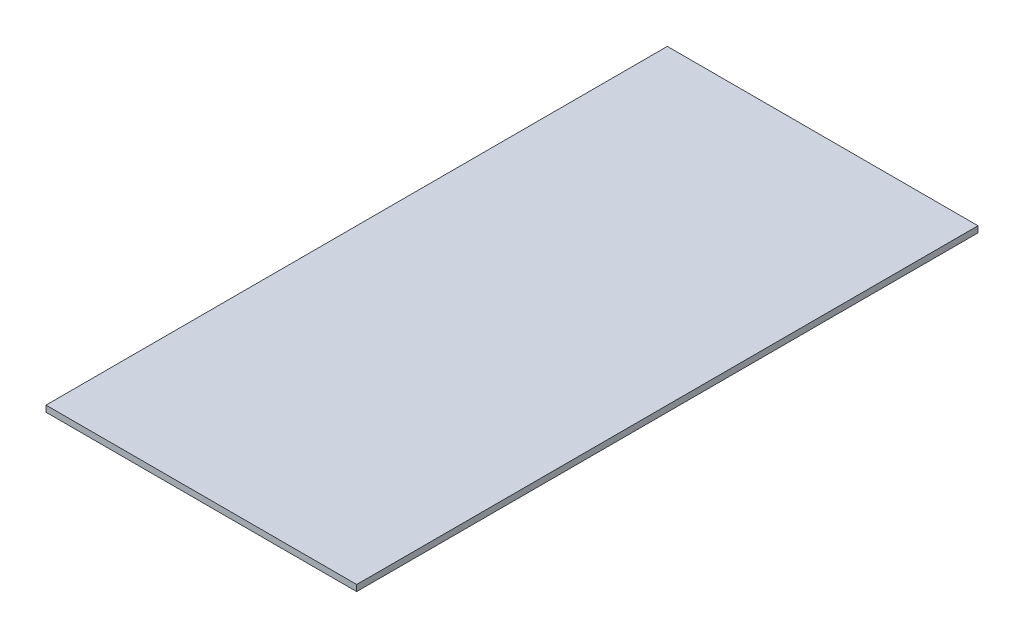
ISO-10303-21;
HEADER;
FILE_DESCRIPTION(('STEP AP214'),'2;1');
FILE_NAME('part.step','',(''),(''),'','','');
FILE_SCHEMA(('AUTOMOTIVE_DESIGN { 1 0 10303 214 1 1 1 1 }'));
ENDSEC;
DATA;
#1=APPLICATION_CONTEXT('core data for automotive mechanical design processes');
#2=APPLICATION_PROTOCOL_DEFINITION('international standard','automotive_design',2000,#1);
#3=PRODUCT_CONTEXT('',#1,'mechanical');
#4=PRODUCT('Part','Part','',(#3));
#5=PRODUCT_RELATED_PRODUCT_CATEGORY('part','',(#4));
#6=PRODUCT_DEFINITION_FORMATION('','',#4);
#7=PRODUCT_DEFINITION_CONTEXT('part definition',#1,'design');
#8=PRODUCT_DEFINITION('design','',#6,#7);
#9=PRODUCT_DEFINITION_SHAPE('','',#8);
#10=(LENGTH_UNIT() NAMED_UNIT(*) SI_UNIT(.MILLI.,.METRE.));
#11=(NAMED_UNIT(*) PLANE_ANGLE_UNIT() SI_UNIT($,.RADIAN.));
#12=(NAMED_UNIT(*) SI_UNIT($,.STERADIAN.) SOLID_ANGLE_UNIT());
#13=UNCERTAINTY_MEASURE_WITH_UNIT(LENGTH_MEASURE(1.E-05),#10,'distance_accuracy_value','');
#14=(GEOMETRIC_REPRESENTATION_CONTEXT(3) GLOBAL_UNCERTAINTY_ASSIGNED_CONTEXT((#13)) GLOBAL_UNIT_ASSIGNED_CONTEXT((#10,
#11,#12)) REPRESENTATION_CONTEXT('',''));
#15=CARTESIAN_POINT('',(0.,0.,0.));
#16=DIRECTION('',(0.,0.,1.));
#17=DIRECTION('',(1.,0.,0.));
#18=AXIS2_PLACEMENT_3D('',#15,#16,#17);
#19=CARTESIAN_POINT('',(457.2,18.25625,914.4));
#20=DIRECTION('',(-1.,0.,0.));
#21=DIRECTION('',(0.,0.,1.));
#22=AXIS2_PLACEMENT_3D('',#19,#20,#21);
#23=PLANE('',#22);
#24=DIRECTION('',(0.,0.,-1.));
#25=VECTOR('',#24,1.);
#26=CARTESIAN_POINT('',(457.2,0.,914.4));
#27=LINE('',#26,#25);
#28=CARTESIAN_POINT('',(457.2,0.,914.4));
#29=VERTEX_POINT('',#28);
#30=CARTESIAN_POINT('',(457.2,0.,-914.4));
#31=VERTEX_POINT('',#30);
#32=EDGE_CURVE('E107',#29,#31,#27,.T.);
#33=ORIENTED_EDGE('',*,*,#32,.T.);
#34=DIRECTION('',(0.,-1.,0.));
#35=VECTOR('',#34,1.);
#36=CARTESIAN_POINT('',(457.2,18.25625,-914.4));
#37=LINE('',#36,#35);
#38=CARTESIAN_POINT('',(457.2,18.25625,-914.4));
#39=VERTEX_POINT('',#38);
#40=EDGE_CURVE('E11',#39,#31,#37,.T.);
#41=ORIENTED_EDGE('',*,*,#40,.F.);
#42=DIRECTION('',(0.,0.,-1.));
#43=VECTOR('',#42,1.);
#44=CARTESIAN_POINT('',(457.2,18.25625,914.4));
#45=LINE('',#44,#43);
#46=CARTESIAN_POINT('',(457.2,18.25625,914.4));
#47=VERTEX_POINT('',#46);
#48=EDGE_CURVE('E91',#47,#39,#45,.T.);
#49=ORIENTED_EDGE('',*,*,#48,.F.);
#50=DIRECTION('',(0.,-1.,0.));
#51=VECTOR('',#50,1.);
#52=CARTESIAN_POINT('',(457.2,18.25625,914.4));
#53=LINE('',#52,#51);
#54=EDGE_CURVE('E103',#47,#29,#53,.T.);
#55=ORIENTED_EDGE('',*,*,#54,.T.);
#56=EDGE_LOOP('',(#33,#41,#49,#55));
#57=FACE_BOUND('',#56,.T.);
#58=ADVANCED_FACE('F39',(#57),#23,.F.);
#59=CARTESIAN_POINT('',(-457.2,18.25625,-914.4));
#60=DIRECTION('',(0.,0.,1.));
#61=DIRECTION('',(1.,0.,0.));
#62=AXIS2_PLACEMENT_3D('',#59,#60,#61);
#63=PLANE('',#62);
#64=DIRECTION('',(-1.,0.,0.));
#65=VECTOR('',#64,1.);
#66=CARTESIAN_POINT('',(-457.2,0.,-914.4));
#67=LINE('',#66,#65);
#68=CARTESIAN_POINT('',(-457.2,0.,-914.4));
#69=VERTEX_POINT('',#68);
#70=EDGE_CURVE('E96',#31,#69,#67,.T.);
#71=ORIENTED_EDGE('',*,*,#70,.T.);
#72=DIRECTION('',(0.,-1.,0.));
#73=VECTOR('',#72,1.);
#74=CARTESIAN_POINT('',(-457.2,18.25625,-914.4));
#75=LINE('',#74,#73);
#76=CARTESIAN_POINT('',(-457.2,18.25625,-914.4));
#77=VERTEX_POINT('',#76);
#78=EDGE_CURVE('E48',#77,#69,#75,.T.);
#79=ORIENTED_EDGE('',*,*,#78,.F.);
#80=DIRECTION('',(-1.,0.,0.));
#81=VECTOR('',#80,1.);
#82=CARTESIAN_POINT('',(-457.2,18.25625,-914.4));
#83=LINE('',#82,#81);
#84=EDGE_CURVE('E86',#39,#77,#83,.T.);
#85=ORIENTED_EDGE('',*,*,#84,.F.);
#86=ORIENTED_EDGE('',*,*,#40,.T.);
#87=EDGE_LOOP('',(#71,#79,#85,#86));
#88=FACE_BOUND('',#87,.T.);
#89=ADVANCED_FACE('F95',(#88),#63,.F.);
#90=CARTESIAN_POINT('',(-457.2,18.25625,914.4));
#91=DIRECTION('',(1.,0.,0.));
#92=DIRECTION('',(0.,0.,-1.));
#93=AXIS2_PLACEMENT_3D('',#90,#91,#92);
#94=PLANE('',#93);
#95=DIRECTION('',(0.,0.,1.));
#96=VECTOR('',#95,1.);
#97=CARTESIAN_POINT('',(-457.2,0.,914.4));
#98=LINE('',#97,#96);
#99=CARTESIAN_POINT('',(-457.2,0.,914.4));
#100=VERTEX_POINT('',#99);
#101=EDGE_CURVE('E73',#69,#100,#98,.T.);
#102=ORIENTED_EDGE('',*,*,#101,.T.);
#103=DIRECTION('',(0.,-1.,0.));
#104=VECTOR('',#103,1.);
#105=CARTESIAN_POINT('',(-457.2,18.25625,914.4));
#106=LINE('',#105,#104);
#107=CARTESIAN_POINT('',(-457.2,18.25625,914.4));
#108=VERTEX_POINT('',#107);
#109=EDGE_CURVE('E98',#108,#100,#106,.T.);
#110=ORIENTED_EDGE('',*,*,#109,.F.);
#111=DIRECTION('',(0.,0.,1.));
#112=VECTOR('',#111,1.);
#113=CARTESIAN_POINT('',(-457.2,18.25625,914.4));
#114=LINE('',#113,#112);
#115=EDGE_CURVE('E89',#77,#108,#114,.T.);
#116=ORIENTED_EDGE('',*,*,#115,.F.);
#117=ORIENTED_EDGE('',*,*,#78,.T.);
#118=EDGE_LOOP('',(#102,#110,#116,#117));
#119=FACE_BOUND('',#118,.T.);
#120=ADVANCED_FACE('F99',(#119),#94,.F.);
#121=CARTESIAN_POINT('',(-457.2,18.25625,914.4));
#122=DIRECTION('',(0.,0.,-1.));
#123=DIRECTION('',(-1.,0.,0.));
#124=AXIS2_PLACEMENT_3D('',#121,#122,#123);
#125=PLANE('',#124);
#126=DIRECTION('',(1.,0.,0.));
#127=VECTOR('',#126,1.);
#128=CARTESIAN_POINT('',(-457.2,0.,914.4));
#129=LINE('',#128,#127);
#130=EDGE_CURVE('E79',#100,#29,#129,.T.);
#131=ORIENTED_EDGE('',*,*,#130,.T.);
#132=ORIENTED_EDGE('',*,*,#54,.F.);
#133=DIRECTION('',(1.,0.,0.));
#134=VECTOR('',#133,1.);
#135=CARTESIAN_POINT('',(-457.2,18.25625,914.4));
#136=LINE('',#135,#134);
#137=EDGE_CURVE('E56',#108,#47,#136,.T.);
#138=ORIENTED_EDGE('',*,*,#137,.F.);
#139=ORIENTED_EDGE('',*,*,#109,.T.);
#140=EDGE_LOOP('',(#131,#132,#138,#139));
#141=FACE_BOUND('',#140,.T.);
#142=ADVANCED_FACE('F120',(#141),#125,.F.);
#143=CARTESIAN_POINT('',(0.,18.25625,0.));
#144=DIRECTION('',(0.,-1.,0.));
#145=DIRECTION('',(0.,0.,-1.));
#146=AXIS2_PLACEMENT_3D('',#143,#144,#145);
#147=PLANE('',#146);
#148=ORIENTED_EDGE('',*,*,#48,.T.);
#149=ORIENTED_EDGE('',*,*,#84,.T.);
#150=ORIENTED_EDGE('',*,*,#115,.T.);
#151=ORIENTED_EDGE('',*,*,#137,.T.);
#152=EDGE_LOOP('',(#148,#149,#150,#151));
#153=FACE_BOUND('',#152,.T.);
#154=ADVANCED_FACE('F87',(#153),#147,.F.);
#155=CARTESIAN_POINT('',(0.,0.,0.));
#156=DIRECTION('',(0.,-1.,0.));
#157=DIRECTION('',(0.,0.,-1.));
#158=AXIS2_PLACEMENT_3D('',#155,#156,#157);
#159=PLANE('',#158);
#160=ORIENTED_EDGE('',*,*,#32,.F.);
#161=ORIENTED_EDGE('',*,*,#130,.F.);
#162=ORIENTED_EDGE('',*,*,#101,.F.);
#163=ORIENTED_EDGE('',*,*,#70,.F.);
#164=EDGE_LOOP('',(#160,#161,#162,#163));
#165=FACE_BOUND('',#164,.T.);
#166=ADVANCED_FACE('F123',(#165),#159,.T.);
#167=CLOSED_SHELL('',(#58,#89,#120,#142,#154,#166));
#168=MANIFOLD_SOLID_BREP('B2',#167);
#169=ADVANCED_BREP_SHAPE_REPRESENTATION('',(#18,#168),#14);
#170=SHAPE_DEFINITION_REPRESENTATION(#9,#169);
ENDSEC;
END-ISO-10303-21;
